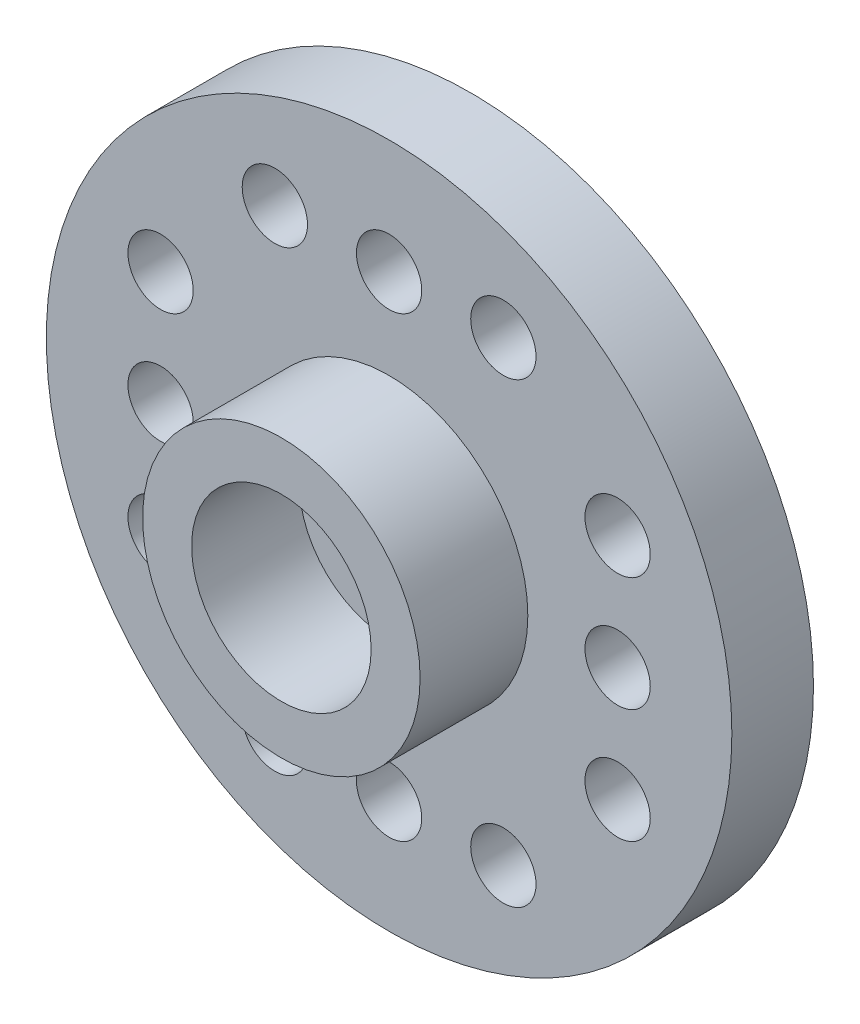
ISO-10303-21;
HEADER;
FILE_DESCRIPTION(('STEP AP214'),'2;1');
FILE_NAME('part.step','',(''),(''),'','','');
FILE_SCHEMA(('AUTOMOTIVE_DESIGN { 1 0 10303 214 1 1 1 1 }'));
ENDSEC;
DATA;
#1=APPLICATION_CONTEXT('core data for automotive mechanical design processes');
#2=APPLICATION_PROTOCOL_DEFINITION('international standard','automotive_design',2000,#1);
#3=PRODUCT_CONTEXT('',#1,'mechanical');
#4=PRODUCT('Part','Part','',(#3));
#5=PRODUCT_RELATED_PRODUCT_CATEGORY('part','',(#4));
#6=PRODUCT_DEFINITION_FORMATION('','',#4);
#7=PRODUCT_DEFINITION_CONTEXT('part definition',#1,'design');
#8=PRODUCT_DEFINITION('design','',#6,#7);
#9=PRODUCT_DEFINITION_SHAPE('','',#8);
#10=(LENGTH_UNIT() NAMED_UNIT(*) SI_UNIT(.MILLI.,.METRE.));
#11=(NAMED_UNIT(*) PLANE_ANGLE_UNIT() SI_UNIT($,.RADIAN.));
#12=(NAMED_UNIT(*) SI_UNIT($,.STERADIAN.) SOLID_ANGLE_UNIT());
#13=UNCERTAINTY_MEASURE_WITH_UNIT(LENGTH_MEASURE(1.E-05),#10,'distance_accuracy_value','');
#14=(GEOMETRIC_REPRESENTATION_CONTEXT(3) GLOBAL_UNCERTAINTY_ASSIGNED_CONTEXT((#13)) GLOBAL_UNIT_ASSIGNED_CONTEXT((#10,
#11,#12)) REPRESENTATION_CONTEXT('',''));
#15=CARTESIAN_POINT('',(0.,0.,0.));
#16=DIRECTION('',(0.,0.,1.));
#17=DIRECTION('',(1.,0.,0.));
#18=AXIS2_PLACEMENT_3D('',#15,#16,#17);
#19=CARTESIAN_POINT('',(0.,0.,1.2));
#20=DIRECTION('',(0.,0.,-1.));
#21=DIRECTION('',(-1.,0.,0.));
#22=AXIS2_PLACEMENT_3D('',#19,#20,#21);
#23=PLANE('',#22);
#24=CARTESIAN_POINT('',(0.,0.,1.2));
#25=DIRECTION('',(0.,0.,-1.));
#26=DIRECTION('',(-1.,0.,0.));
#27=AXIS2_PLACEMENT_3D('',#24,#25,#26);
#28=CIRCLE('',#27,4.7);
#29=CARTESIAN_POINT('',(-4.7,0.,1.2));
#30=VERTEX_POINT('',#29);
#31=EDGE_CURVE('E55',#30,#30,#28,.T.);
#32=ORIENTED_EDGE('',*,*,#31,.T.);
#33=EDGE_LOOP('',(#32));
#34=FACE_BOUND('',#33,.T.);
#35=CARTESIAN_POINT('',(0.,0.,1.2));
#36=DIRECTION('',(0.,0.,-1.));
#37=DIRECTION('',(-1.,0.,0.));
#38=AXIS2_PLACEMENT_3D('',#35,#36,#37);
#39=CIRCLE('',#38,3.15);
#40=CARTESIAN_POINT('',(-3.15,0.,1.2));
#41=VERTEX_POINT('',#40);
#42=EDGE_CURVE('E409',#41,#41,#39,.T.);
#43=ORIENTED_EDGE('',*,*,#42,.F.);
#44=EDGE_LOOP('',(#43));
#45=FACE_BOUND('',#44,.T.);
#46=ADVANCED_FACE('F33',(#34,#45),#23,.T.);
#47=CARTESIAN_POINT('',(0.,0.,5.8));
#48=DIRECTION('',(0.,0.,-1.));
#49=DIRECTION('',(-1.,0.,0.));
#50=AXIS2_PLACEMENT_3D('',#47,#48,#49);
#51=CYLINDRICAL_SURFACE('',#50,1.5);
#52=CARTESIAN_POINT('',(0.,0.,2.5));
#53=DIRECTION('',(0.,0.,1.));
#54=DIRECTION('',(1.,0.,0.));
#55=AXIS2_PLACEMENT_3D('',#52,#53,#54);
#56=CIRCLE('',#55,1.5);
#57=CARTESIAN_POINT('',(1.5,0.,2.5));
#58=VERTEX_POINT('',#57);
#59=EDGE_CURVE('E52',#58,#58,#56,.T.);
#60=ORIENTED_EDGE('',*,*,#59,.T.);
#61=EDGE_LOOP('',(#60));
#62=FACE_BOUND('',#61,.T.);
#63=CARTESIAN_POINT('',(0.,0.,1.2));
#64=DIRECTION('',(0.,0.,-1.));
#65=DIRECTION('',(-1.,0.,0.));
#66=AXIS2_PLACEMENT_3D('',#63,#64,#65);
#67=CIRCLE('',#66,1.5);
#68=CARTESIAN_POINT('',(-1.5,0.,1.2));
#69=VERTEX_POINT('',#68);
#70=EDGE_CURVE('E62',#69,#69,#67,.T.);
#71=ORIENTED_EDGE('',*,*,#70,.T.);
#72=EDGE_LOOP('',(#71));
#73=FACE_BOUND('',#72,.T.);
#74=ADVANCED_FACE('F84',(#62,#73),#51,.F.);
#75=CARTESIAN_POINT('',(0.,0.,2.5));
#76=DIRECTION('',(0.,0.,1.));
#77=DIRECTION('',(1.,0.,0.));
#78=AXIS2_PLACEMENT_3D('',#75,#76,#77);
#79=PLANE('',#78);
#80=CARTESIAN_POINT('',(-3.50000000000125,-7.,2.5));
#81=DIRECTION('',(0.,0.,1.));
#82=DIRECTION('',(1.,0.,0.));
#83=AXIS2_PLACEMENT_3D('',#80,#81,#82);
#84=CIRCLE('',#83,1.);
#85=CARTESIAN_POINT('',(-2.50000000000125,-7.,2.5));
#86=VERTEX_POINT('',#85);
#87=EDGE_CURVE('E333',#86,#86,#84,.T.);
#88=ORIENTED_EDGE('',*,*,#87,.F.);
#89=EDGE_LOOP('',(#88));
#90=FACE_BOUND('',#89,.T.);
#91=CARTESIAN_POINT('',(3.5,-7.,2.5));
#92=DIRECTION('',(0.,0.,1.));
#93=DIRECTION('',(1.,0.,0.));
#94=AXIS2_PLACEMENT_3D('',#91,#92,#93);
#95=CIRCLE('',#94,1.);
#96=CARTESIAN_POINT('',(4.5,-7.,2.5));
#97=VERTEX_POINT('',#96);
#98=EDGE_CURVE('E343',#97,#97,#95,.T.);
#99=ORIENTED_EDGE('',*,*,#98,.F.);
#100=EDGE_LOOP('',(#99));
#101=FACE_BOUND('',#100,.T.);
#102=CARTESIAN_POINT('',(-7.00000000000001,3.5,2.5));
#103=DIRECTION('',(0.,0.,1.));
#104=DIRECTION('',(1.,0.,0.));
#105=AXIS2_PLACEMENT_3D('',#102,#103,#104);
#106=CIRCLE('',#105,1.);
#107=CARTESIAN_POINT('',(-6.00000000000001,3.5,2.5));
#108=VERTEX_POINT('',#107);
#109=EDGE_CURVE('E349',#108,#108,#106,.T.);
#110=ORIENTED_EDGE('',*,*,#109,.F.);
#111=EDGE_LOOP('',(#110));
#112=FACE_BOUND('',#111,.T.);
#113=CARTESIAN_POINT('',(-7.00000000000001,-3.5,2.5));
#114=DIRECTION('',(0.,0.,1.));
#115=DIRECTION('',(1.,0.,0.));
#116=AXIS2_PLACEMENT_3D('',#113,#114,#115);
#117=CIRCLE('',#116,1.);
#118=CARTESIAN_POINT('',(-6.00000000000001,-3.5,2.5));
#119=VERTEX_POINT('',#118);
#120=EDGE_CURVE('E355',#119,#119,#117,.T.);
#121=ORIENTED_EDGE('',*,*,#120,.F.);
#122=EDGE_LOOP('',(#121));
#123=FACE_BOUND('',#122,.T.);
#124=CARTESIAN_POINT('',(7.00000000000002,-3.5,2.5));
#125=DIRECTION('',(0.,0.,1.));
#126=DIRECTION('',(1.,0.,0.));
#127=AXIS2_PLACEMENT_3D('',#124,#125,#126);
#128=CIRCLE('',#127,1.);
#129=CARTESIAN_POINT('',(8.00000000000002,-3.5,2.5));
#130=VERTEX_POINT('',#129);
#131=EDGE_CURVE('E361',#130,#130,#128,.T.);
#132=ORIENTED_EDGE('',*,*,#131,.F.);
#133=EDGE_LOOP('',(#132));
#134=FACE_BOUND('',#133,.T.);
#135=CARTESIAN_POINT('',(7.00000000000001,3.5,2.5));
#136=DIRECTION('',(0.,0.,1.));
#137=DIRECTION('',(1.,0.,0.));
#138=AXIS2_PLACEMENT_3D('',#135,#136,#137);
#139=CIRCLE('',#138,1.);
#140=CARTESIAN_POINT('',(8.00000000000001,3.5,2.5));
#141=VERTEX_POINT('',#140);
#142=EDGE_CURVE('E367',#141,#141,#139,.T.);
#143=ORIENTED_EDGE('',*,*,#142,.F.);
#144=EDGE_LOOP('',(#143));
#145=FACE_BOUND('',#144,.T.);
#146=CARTESIAN_POINT('',(3.5,7.,2.5));
#147=DIRECTION('',(0.,0.,1.));
#148=DIRECTION('',(1.,0.,0.));
#149=AXIS2_PLACEMENT_3D('',#146,#147,#148);
#150=CIRCLE('',#149,1.);
#151=CARTESIAN_POINT('',(4.5,7.,2.5));
#152=VERTEX_POINT('',#151);
#153=EDGE_CURVE('E373',#152,#152,#150,.T.);
#154=ORIENTED_EDGE('',*,*,#153,.F.);
#155=EDGE_LOOP('',(#154));
#156=FACE_BOUND('',#155,.T.);
#157=CARTESIAN_POINT('',(-3.5,7.,2.5));
#158=DIRECTION('',(0.,0.,1.));
#159=DIRECTION('',(1.,0.,0.));
#160=AXIS2_PLACEMENT_3D('',#157,#158,#159);
#161=CIRCLE('',#160,0.999999999999999);
#162=CARTESIAN_POINT('',(-2.5,7.,2.5));
#163=VERTEX_POINT('',#162);
#164=EDGE_CURVE('E379',#163,#163,#161,.T.);
#165=ORIENTED_EDGE('',*,*,#164,.F.);
#166=EDGE_LOOP('',(#165));
#167=FACE_BOUND('',#166,.T.);
#168=CARTESIAN_POINT('',(-7.,0.,2.5));
#169=DIRECTION('',(0.,0.,1.));
#170=DIRECTION('',(1.,0.,0.));
#171=AXIS2_PLACEMENT_3D('',#168,#169,#170);
#172=CIRCLE('',#171,1.);
#173=CARTESIAN_POINT('',(-6.,0.,2.5));
#174=VERTEX_POINT('',#173);
#175=EDGE_CURVE('E385',#174,#174,#172,.T.);
#176=ORIENTED_EDGE('',*,*,#175,.F.);
#177=EDGE_LOOP('',(#176));
#178=FACE_BOUND('',#177,.T.);
#179=CARTESIAN_POINT('',(7.,0.,2.5));
#180=DIRECTION('',(0.,0.,1.));
#181=DIRECTION('',(1.,0.,0.));
#182=AXIS2_PLACEMENT_3D('',#179,#180,#181);
#183=CIRCLE('',#182,1.);
#184=CARTESIAN_POINT('',(8.,0.,2.5));
#185=VERTEX_POINT('',#184);
#186=EDGE_CURVE('E391',#185,#185,#183,.T.);
#187=ORIENTED_EDGE('',*,*,#186,.F.);
#188=EDGE_LOOP('',(#187));
#189=FACE_BOUND('',#188,.T.);
#190=CARTESIAN_POINT('',(0.,-7.,2.5));
#191=DIRECTION('',(0.,0.,1.));
#192=DIRECTION('',(1.,0.,0.));
#193=AXIS2_PLACEMENT_3D('',#190,#191,#192);
#194=CIRCLE('',#193,1.);
#195=CARTESIAN_POINT('',(1.,-7.,2.5));
#196=VERTEX_POINT('',#195);
#197=EDGE_CURVE('E397',#196,#196,#194,.T.);
#198=ORIENTED_EDGE('',*,*,#197,.F.);
#199=EDGE_LOOP('',(#198));
#200=FACE_BOUND('',#199,.T.);
#201=CARTESIAN_POINT('',(0.,7.,2.5));
#202=DIRECTION('',(0.,0.,1.));
#203=DIRECTION('',(1.,0.,0.));
#204=AXIS2_PLACEMENT_3D('',#201,#202,#203);
#205=CIRCLE('',#204,1.);
#206=CARTESIAN_POINT('',(1.,7.,2.5));
#207=VERTEX_POINT('',#206);
#208=EDGE_CURVE('E403',#207,#207,#205,.T.);
#209=ORIENTED_EDGE('',*,*,#208,.F.);
#210=EDGE_LOOP('',(#209));
#211=FACE_BOUND('',#210,.T.);
#212=CARTESIAN_POINT('',(0.,0.,2.5));
#213=DIRECTION('',(0.,0.,1.));
#214=DIRECTION('',(1.,0.,0.));
#215=AXIS2_PLACEMENT_3D('',#212,#213,#214);
#216=CIRCLE('',#215,10.5);
#217=CARTESIAN_POINT('',(10.5,0.,2.5));
#218=VERTEX_POINT('',#217);
#219=EDGE_CURVE('E44',#218,#218,#216,.T.);
#220=ORIENTED_EDGE('',*,*,#219,.T.);
#221=EDGE_LOOP('',(#220));
#222=FACE_BOUND('',#221,.T.);
#223=CARTESIAN_POINT('',(0.,0.,2.5));
#224=DIRECTION('',(0.,0.,1.));
#225=DIRECTION('',(1.,0.,0.));
#226=AXIS2_PLACEMENT_3D('',#223,#224,#225);
#227=CIRCLE('',#226,4.25);
#228=CARTESIAN_POINT('',(4.25,0.,2.5));
#229=VERTEX_POINT('',#228);
#230=EDGE_CURVE('E59',#229,#229,#227,.T.);
#231=ORIENTED_EDGE('',*,*,#230,.F.);
#232=EDGE_LOOP('',(#231));
#233=FACE_BOUND('',#232,.T.);
#234=ADVANCED_FACE('F82',(#90,#101,#112,#123,#134,#145,#156,#167,#178,#189,#200,#211,#222,#233),
#79,.T.);
#235=CARTESIAN_POINT('',(0.,0.,2.5));
#236=DIRECTION('',(0.,0.,-1.));
#237=DIRECTION('',(-1.,0.,0.));
#238=AXIS2_PLACEMENT_3D('',#235,#236,#237);
#239=CYLINDRICAL_SURFACE('',#238,10.5);
#240=ORIENTED_EDGE('',*,*,#219,.F.);
#241=EDGE_LOOP('',(#240));
#242=FACE_BOUND('',#241,.T.);
#243=CARTESIAN_POINT('',(0.,0.,0.));
#244=DIRECTION('',(0.,0.,1.));
#245=DIRECTION('',(1.,0.,0.));
#246=AXIS2_PLACEMENT_3D('',#243,#244,#245);
#247=CIRCLE('',#246,10.5);
#248=CARTESIAN_POINT('',(10.5,0.,0.));
#249=VERTEX_POINT('',#248);
#250=EDGE_CURVE('E49',#249,#249,#247,.T.);
#251=ORIENTED_EDGE('',*,*,#250,.T.);
#252=EDGE_LOOP('',(#251));
#253=FACE_BOUND('',#252,.T.);
#254=ADVANCED_FACE('F35',(#242,#253),#239,.T.);
#255=CARTESIAN_POINT('',(0.,0.,0.));
#256=DIRECTION('',(0.,0.,1.));
#257=DIRECTION('',(1.,0.,0.));
#258=AXIS2_PLACEMENT_3D('',#255,#256,#257);
#259=PLANE('',#258);
#260=CARTESIAN_POINT('',(-3.50000000000125,-7.,0.));
#261=DIRECTION('',(0.,0.,-1.));
#262=DIRECTION('',(-1.,0.,0.));
#263=AXIS2_PLACEMENT_3D('',#260,#261,#262);
#264=CIRCLE('',#263,1.);
#265=CARTESIAN_POINT('',(-4.50000000000125,-7.,0.));
#266=VERTEX_POINT('',#265);
#267=EDGE_CURVE('E336',#266,#266,#264,.T.);
#268=ORIENTED_EDGE('',*,*,#267,.F.);
#269=EDGE_LOOP('',(#268));
#270=FACE_BOUND('',#269,.T.);
#271=CARTESIAN_POINT('',(3.5,-7.,0.));
#272=DIRECTION('',(0.,0.,-1.));
#273=DIRECTION('',(-1.,0.,0.));
#274=AXIS2_PLACEMENT_3D('',#271,#272,#273);
#275=CIRCLE('',#274,1.);
#276=CARTESIAN_POINT('',(2.5,-7.,0.));
#277=VERTEX_POINT('',#276);
#278=EDGE_CURVE('E338',#277,#277,#275,.T.);
#279=ORIENTED_EDGE('',*,*,#278,.F.);
#280=EDGE_LOOP('',(#279));
#281=FACE_BOUND('',#280,.T.);
#282=CARTESIAN_POINT('',(-7.00000000000001,3.5,0.));
#283=DIRECTION('',(0.,0.,-1.));
#284=DIRECTION('',(-1.,0.,0.));
#285=AXIS2_PLACEMENT_3D('',#282,#283,#284);
#286=CIRCLE('',#285,1.);
#287=CARTESIAN_POINT('',(-8.00000000000001,3.5,0.));
#288=VERTEX_POINT('',#287);
#289=EDGE_CURVE('E346',#288,#288,#286,.T.);
#290=ORIENTED_EDGE('',*,*,#289,.F.);
#291=EDGE_LOOP('',(#290));
#292=FACE_BOUND('',#291,.T.);
#293=CARTESIAN_POINT('',(-7.00000000000001,-3.5,0.));
#294=DIRECTION('',(0.,0.,-1.));
#295=DIRECTION('',(-1.,0.,0.));
#296=AXIS2_PLACEMENT_3D('',#293,#294,#295);
#297=CIRCLE('',#296,1.);
#298=CARTESIAN_POINT('',(-8.00000000000001,-3.5,0.));
#299=VERTEX_POINT('',#298);
#300=EDGE_CURVE('E352',#299,#299,#297,.T.);
#301=ORIENTED_EDGE('',*,*,#300,.F.);
#302=EDGE_LOOP('',(#301));
#303=FACE_BOUND('',#302,.T.);
#304=CARTESIAN_POINT('',(7.00000000000002,-3.5,0.));
#305=DIRECTION('',(0.,0.,-1.));
#306=DIRECTION('',(-1.,0.,0.));
#307=AXIS2_PLACEMENT_3D('',#304,#305,#306);
#308=CIRCLE('',#307,1.);
#309=CARTESIAN_POINT('',(6.00000000000002,-3.5,0.));
#310=VERTEX_POINT('',#309);
#311=EDGE_CURVE('E358',#310,#310,#308,.T.);
#312=ORIENTED_EDGE('',*,*,#311,.F.);
#313=EDGE_LOOP('',(#312));
#314=FACE_BOUND('',#313,.T.);
#315=CARTESIAN_POINT('',(7.00000000000001,3.5,0.));
#316=DIRECTION('',(0.,0.,-1.));
#317=DIRECTION('',(-1.,0.,0.));
#318=AXIS2_PLACEMENT_3D('',#315,#316,#317);
#319=CIRCLE('',#318,1.);
#320=CARTESIAN_POINT('',(6.00000000000001,3.5,0.));
#321=VERTEX_POINT('',#320);
#322=EDGE_CURVE('E364',#321,#321,#319,.T.);
#323=ORIENTED_EDGE('',*,*,#322,.F.);
#324=EDGE_LOOP('',(#323));
#325=FACE_BOUND('',#324,.T.);
#326=CARTESIAN_POINT('',(3.5,7.,0.));
#327=DIRECTION('',(0.,0.,-1.));
#328=DIRECTION('',(-1.,0.,0.));
#329=AXIS2_PLACEMENT_3D('',#326,#327,#328);
#330=CIRCLE('',#329,1.);
#331=CARTESIAN_POINT('',(2.5,7.,0.));
#332=VERTEX_POINT('',#331);
#333=EDGE_CURVE('E370',#332,#332,#330,.T.);
#334=ORIENTED_EDGE('',*,*,#333,.F.);
#335=EDGE_LOOP('',(#334));
#336=FACE_BOUND('',#335,.T.);
#337=CARTESIAN_POINT('',(-3.5,7.,0.));
#338=DIRECTION('',(0.,0.,-1.));
#339=DIRECTION('',(-1.,0.,0.));
#340=AXIS2_PLACEMENT_3D('',#337,#338,#339);
#341=CIRCLE('',#340,0.999999999999999);
#342=CARTESIAN_POINT('',(-4.5,7.,0.));
#343=VERTEX_POINT('',#342);
#344=EDGE_CURVE('E376',#343,#343,#341,.T.);
#345=ORIENTED_EDGE('',*,*,#344,.F.);
#346=EDGE_LOOP('',(#345));
#347=FACE_BOUND('',#346,.T.);
#348=CARTESIAN_POINT('',(-7.,0.,0.));
#349=DIRECTION('',(0.,0.,-1.));
#350=DIRECTION('',(-1.,0.,0.));
#351=AXIS2_PLACEMENT_3D('',#348,#349,#350);
#352=CIRCLE('',#351,1.);
#353=CARTESIAN_POINT('',(-8.,0.,0.));
#354=VERTEX_POINT('',#353);
#355=EDGE_CURVE('E382',#354,#354,#352,.T.);
#356=ORIENTED_EDGE('',*,*,#355,.F.);
#357=EDGE_LOOP('',(#356));
#358=FACE_BOUND('',#357,.T.);
#359=CARTESIAN_POINT('',(7.,0.,0.));
#360=DIRECTION('',(0.,0.,-1.));
#361=DIRECTION('',(-1.,0.,0.));
#362=AXIS2_PLACEMENT_3D('',#359,#360,#361);
#363=CIRCLE('',#362,1.);
#364=CARTESIAN_POINT('',(6.,0.,0.));
#365=VERTEX_POINT('',#364);
#366=EDGE_CURVE('E388',#365,#365,#363,.T.);
#367=ORIENTED_EDGE('',*,*,#366,.F.);
#368=EDGE_LOOP('',(#367));
#369=FACE_BOUND('',#368,.T.);
#370=CARTESIAN_POINT('',(0.,-7.,0.));
#371=DIRECTION('',(0.,0.,-1.));
#372=DIRECTION('',(-1.,0.,0.));
#373=AXIS2_PLACEMENT_3D('',#370,#371,#372);
#374=CIRCLE('',#373,1.);
#375=CARTESIAN_POINT('',(-1.,-7.,0.));
#376=VERTEX_POINT('',#375);
#377=EDGE_CURVE('E394',#376,#376,#374,.T.);
#378=ORIENTED_EDGE('',*,*,#377,.F.);
#379=EDGE_LOOP('',(#378));
#380=FACE_BOUND('',#379,.T.);
#381=CARTESIAN_POINT('',(0.,7.,0.));
#382=DIRECTION('',(0.,0.,-1.));
#383=DIRECTION('',(-1.,0.,0.));
#384=AXIS2_PLACEMENT_3D('',#381,#382,#383);
#385=CIRCLE('',#384,1.);
#386=CARTESIAN_POINT('',(-1.,7.,0.));
#387=VERTEX_POINT('',#386);
#388=EDGE_CURVE('E400',#387,#387,#385,.T.);
#389=ORIENTED_EDGE('',*,*,#388,.F.);
#390=EDGE_LOOP('',(#389));
#391=FACE_BOUND('',#390,.T.);
#392=CARTESIAN_POINT('',(0.,0.,0.));
#393=DIRECTION('',(0.,0.,-1.));
#394=DIRECTION('',(-1.,0.,0.));
#395=AXIS2_PLACEMENT_3D('',#392,#393,#394);
#396=CIRCLE('',#395,4.7);
#397=CARTESIAN_POINT('',(-4.7,0.,0.));
#398=VERTEX_POINT('',#397);
#399=EDGE_CURVE('E67',#398,#398,#396,.T.);
#400=ORIENTED_EDGE('',*,*,#399,.F.);
#401=EDGE_LOOP('',(#400));
#402=FACE_BOUND('',#401,.T.);
#403=ORIENTED_EDGE('',*,*,#250,.F.);
#404=EDGE_LOOP('',(#403));
#405=FACE_BOUND('',#404,.T.);
#406=ADVANCED_FACE('F92',(#270,#281,#292,#303,#314,#325,#336,#347,#358,#369,#380,#391,#402,
#405),#259,.F.);
#407=CARTESIAN_POINT('',(0.,0.,5.8));
#408=DIRECTION('',(0.,0.,1.));
#409=DIRECTION('',(1.,0.,0.));
#410=AXIS2_PLACEMENT_3D('',#407,#408,#409);
#411=PLANE('',#410);
#412=CARTESIAN_POINT('',(0.,0.,5.8));
#413=DIRECTION('',(0.,0.,1.));
#414=DIRECTION('',(1.,0.,0.));
#415=AXIS2_PLACEMENT_3D('',#412,#413,#414);
#416=CIRCLE('',#415,4.25);
#417=CARTESIAN_POINT('',(4.25,0.,5.8));
#418=VERTEX_POINT('',#417);
#419=EDGE_CURVE('E74',#418,#418,#416,.T.);
#420=ORIENTED_EDGE('',*,*,#419,.T.);
#421=EDGE_LOOP('',(#420));
#422=FACE_BOUND('',#421,.T.);
#423=CARTESIAN_POINT('',(0.,0.,5.8));
#424=DIRECTION('',(0.,0.,1.));
#425=DIRECTION('',(1.,0.,0.));
#426=AXIS2_PLACEMENT_3D('',#423,#424,#425);
#427=CIRCLE('',#426,2.75);
#428=CARTESIAN_POINT('',(2.75,0.,5.8));
#429=VERTEX_POINT('',#428);
#430=EDGE_CURVE('E54',#429,#429,#427,.T.);
#431=ORIENTED_EDGE('',*,*,#430,.F.);
#432=EDGE_LOOP('',(#431));
#433=FACE_BOUND('',#432,.T.);
#434=ADVANCED_FACE('F131',(#422,#433),#411,.T.);
#435=CARTESIAN_POINT('',(0.,0.,5.8));
#436=DIRECTION('',(0.,0.,-1.));
#437=DIRECTION('',(-1.,0.,0.));
#438=AXIS2_PLACEMENT_3D('',#435,#436,#437);
#439=CYLINDRICAL_SURFACE('',#438,4.25);
#440=ORIENTED_EDGE('',*,*,#419,.F.);
#441=EDGE_LOOP('',(#440));
#442=FACE_BOUND('',#441,.T.);
#443=ORIENTED_EDGE('',*,*,#230,.T.);
#444=EDGE_LOOP('',(#443));
#445=FACE_BOUND('',#444,.T.);
#446=ADVANCED_FACE('F80',(#442,#445),#439,.T.);
#447=CARTESIAN_POINT('',(0.,0.,5.8));
#448=DIRECTION('',(0.,0.,-1.));
#449=DIRECTION('',(-1.,0.,0.));
#450=AXIS2_PLACEMENT_3D('',#447,#448,#449);
#451=CYLINDRICAL_SURFACE('',#450,2.75);
#452=ORIENTED_EDGE('',*,*,#430,.T.);
#453=EDGE_LOOP('',(#452));
#454=FACE_BOUND('',#453,.T.);
#455=CARTESIAN_POINT('',(0.,0.,2.5));
#456=DIRECTION('',(0.,0.,1.));
#457=DIRECTION('',(1.,0.,0.));
#458=AXIS2_PLACEMENT_3D('',#455,#456,#457);
#459=CIRCLE('',#458,2.75);
#460=CARTESIAN_POINT('',(2.75,0.,2.5));
#461=VERTEX_POINT('',#460);
#462=EDGE_CURVE('E40',#461,#461,#459,.F.);
#463=ORIENTED_EDGE('',*,*,#462,.T.);
#464=EDGE_LOOP('',(#463));
#465=FACE_BOUND('',#464,.T.);
#466=ADVANCED_FACE('F100',(#454,#465),#451,.F.);
#467=ORIENTED_EDGE('',*,*,#59,.F.);
#468=EDGE_LOOP('',(#467));
#469=FACE_BOUND('',#468,.T.);
#470=ORIENTED_EDGE('',*,*,#462,.F.);
#471=EDGE_LOOP('',(#470));
#472=FACE_BOUND('',#471,.T.);
#473=ADVANCED_FACE('F87',(#469,#472),#79,.T.);
#474=CARTESIAN_POINT('',(0.,0.,1.2));
#475=DIRECTION('',(0.,0.,-1.));
#476=DIRECTION('',(-1.,0.,0.));
#477=AXIS2_PLACEMENT_3D('',#474,#475,#476);
#478=CYLINDRICAL_SURFACE('',#477,4.7);
#479=ORIENTED_EDGE('',*,*,#31,.F.);
#480=EDGE_LOOP('',(#479));
#481=FACE_BOUND('',#480,.T.);
#482=ORIENTED_EDGE('',*,*,#399,.T.);
#483=EDGE_LOOP('',(#482));
#484=FACE_BOUND('',#483,.T.);
#485=ADVANCED_FACE('F99',(#481,#484),#478,.F.);
#486=CARTESIAN_POINT('',(0.,0.,1.2));
#487=DIRECTION('',(0.,0.,-1.));
#488=DIRECTION('',(-1.,0.,0.));
#489=AXIS2_PLACEMENT_3D('',#486,#487,#488);
#490=CIRCLE('',#489,3.);
#491=CARTESIAN_POINT('',(-3.,0.,1.2));
#492=VERTEX_POINT('',#491);
#493=EDGE_CURVE('E10',#492,#492,#490,.F.);
#494=ORIENTED_EDGE('',*,*,#493,.F.);
#495=EDGE_LOOP('',(#494));
#496=FACE_BOUND('',#495,.T.);
#497=ORIENTED_EDGE('',*,*,#70,.F.);
#498=EDGE_LOOP('',(#497));
#499=FACE_BOUND('',#498,.T.);
#500=ADVANCED_FACE('F104',(#496,#499),#23,.T.);
#501=CARTESIAN_POINT('',(0.,0.,0.));
#502=DIRECTION('',(0.,0.,-1.));
#503=DIRECTION('',(-1.,0.,0.));
#504=AXIS2_PLACEMENT_3D('',#501,#502,#503);
#505=PLANE('',#504);
#506=CARTESIAN_POINT('',(0.,0.,0.));
#507=DIRECTION('',(0.,0.,-1.));
#508=DIRECTION('',(-1.,0.,0.));
#509=AXIS2_PLACEMENT_3D('',#506,#507,#508);
#510=CIRCLE('',#509,3.15);
#511=CARTESIAN_POINT('',(-3.15,0.,0.));
#512=VERTEX_POINT('',#511);
#513=EDGE_CURVE('E72',#512,#512,#510,.T.);
#514=ORIENTED_EDGE('',*,*,#513,.T.);
#515=EDGE_LOOP('',(#514));
#516=FACE_BOUND('',#515,.T.);
#517=CARTESIAN_POINT('',(0.,0.,0.));
#518=DIRECTION('',(0.,0.,-1.));
#519=DIRECTION('',(-1.,0.,0.));
#520=AXIS2_PLACEMENT_3D('',#517,#518,#519);
#521=CIRCLE('',#520,3.);
#522=CARTESIAN_POINT('',(-3.,0.,0.));
#523=VERTEX_POINT('',#522);
#524=EDGE_CURVE('E406',#523,#523,#521,.T.);
#525=ORIENTED_EDGE('',*,*,#524,.F.);
#526=EDGE_LOOP('',(#525));
#527=FACE_BOUND('',#526,.T.);
#528=ADVANCED_FACE('F111',(#516,#527),#505,.T.);
#529=CARTESIAN_POINT('',(0.,0.,0.));
#530=DIRECTION('',(0.,0.,1.));
#531=DIRECTION('',(1.,0.,0.));
#532=AXIS2_PLACEMENT_3D('',#529,#530,#531);
#533=CYLINDRICAL_SURFACE('',#532,3.15);
#534=ORIENTED_EDGE('',*,*,#513,.F.);
#535=EDGE_LOOP('',(#534));
#536=FACE_BOUND('',#535,.T.);
#537=ORIENTED_EDGE('',*,*,#42,.T.);
#538=EDGE_LOOP('',(#537));
#539=FACE_BOUND('',#538,.T.);
#540=ADVANCED_FACE('F117',(#536,#539),#533,.T.);
#541=CARTESIAN_POINT('',(0.,0.,0.));
#542=DIRECTION('',(0.,0.,1.));
#543=DIRECTION('',(1.,0.,0.));
#544=AXIS2_PLACEMENT_3D('',#541,#542,#543);
#545=CYLINDRICAL_SURFACE('',#544,3.);
#546=ORIENTED_EDGE('',*,*,#524,.T.);
#547=EDGE_LOOP('',(#546));
#548=FACE_BOUND('',#547,.T.);
#549=ORIENTED_EDGE('',*,*,#493,.T.);
#550=EDGE_LOOP('',(#549));
#551=FACE_BOUND('',#550,.T.);
#552=ADVANCED_FACE('F187',(#548,#551),#545,.F.);
#553=CARTESIAN_POINT('',(0.,7.,5.8));
#554=DIRECTION('',(0.,0.,-1.));
#555=DIRECTION('',(-1.,0.,0.));
#556=AXIS2_PLACEMENT_3D('',#553,#554,#555);
#557=CYLINDRICAL_SURFACE('',#556,1.);
#558=ORIENTED_EDGE('',*,*,#208,.T.);
#559=EDGE_LOOP('',(#558));
#560=FACE_BOUND('',#559,.T.);
#561=ORIENTED_EDGE('',*,*,#388,.T.);
#562=EDGE_LOOP('',(#561));
#563=FACE_BOUND('',#562,.T.);
#564=ADVANCED_FACE('F195',(#560,#563),#557,.F.);
#565=CARTESIAN_POINT('',(0.,-7.,5.8));
#566=DIRECTION('',(0.,0.,-1.));
#567=DIRECTION('',(-1.,0.,0.));
#568=AXIS2_PLACEMENT_3D('',#565,#566,#567);
#569=CYLINDRICAL_SURFACE('',#568,1.);
#570=ORIENTED_EDGE('',*,*,#197,.T.);
#571=EDGE_LOOP('',(#570));
#572=FACE_BOUND('',#571,.T.);
#573=ORIENTED_EDGE('',*,*,#377,.T.);
#574=EDGE_LOOP('',(#573));
#575=FACE_BOUND('',#574,.T.);
#576=ADVANCED_FACE('F217',(#572,#575),#569,.F.);
#577=CARTESIAN_POINT('',(7.,0.,5.8));
#578=DIRECTION('',(0.,0.,-1.));
#579=DIRECTION('',(-1.,0.,0.));
#580=AXIS2_PLACEMENT_3D('',#577,#578,#579);
#581=CYLINDRICAL_SURFACE('',#580,1.);
#582=ORIENTED_EDGE('',*,*,#186,.T.);
#583=EDGE_LOOP('',(#582));
#584=FACE_BOUND('',#583,.T.);
#585=ORIENTED_EDGE('',*,*,#366,.T.);
#586=EDGE_LOOP('',(#585));
#587=FACE_BOUND('',#586,.T.);
#588=ADVANCED_FACE('F227',(#584,#587),#581,.F.);
#589=CARTESIAN_POINT('',(-7.,0.,5.8));
#590=DIRECTION('',(0.,0.,-1.));
#591=DIRECTION('',(-1.,0.,0.));
#592=AXIS2_PLACEMENT_3D('',#589,#590,#591);
#593=CYLINDRICAL_SURFACE('',#592,1.);
#594=ORIENTED_EDGE('',*,*,#175,.T.);
#595=EDGE_LOOP('',(#594));
#596=FACE_BOUND('',#595,.T.);
#597=ORIENTED_EDGE('',*,*,#355,.T.);
#598=EDGE_LOOP('',(#597));
#599=FACE_BOUND('',#598,.T.);
#600=ADVANCED_FACE('F237',(#596,#599),#593,.F.);
#601=CARTESIAN_POINT('',(-3.5,7.,5.8));
#602=DIRECTION('',(0.,0.,-1.));
#603=DIRECTION('',(-1.,0.,0.));
#604=AXIS2_PLACEMENT_3D('',#601,#602,#603);
#605=CYLINDRICAL_SURFACE('',#604,0.999999999999999);
#606=ORIENTED_EDGE('',*,*,#164,.T.);
#607=EDGE_LOOP('',(#606));
#608=FACE_BOUND('',#607,.T.);
#609=ORIENTED_EDGE('',*,*,#344,.T.);
#610=EDGE_LOOP('',(#609));
#611=FACE_BOUND('',#610,.T.);
#612=ADVANCED_FACE('F247',(#608,#611),#605,.F.);
#613=CARTESIAN_POINT('',(3.5,7.,5.8));
#614=DIRECTION('',(0.,0.,-1.));
#615=DIRECTION('',(-1.,0.,0.));
#616=AXIS2_PLACEMENT_3D('',#613,#614,#615);
#617=CYLINDRICAL_SURFACE('',#616,1.);
#618=ORIENTED_EDGE('',*,*,#153,.T.);
#619=EDGE_LOOP('',(#618));
#620=FACE_BOUND('',#619,.T.);
#621=ORIENTED_EDGE('',*,*,#333,.T.);
#622=EDGE_LOOP('',(#621));
#623=FACE_BOUND('',#622,.T.);
#624=ADVANCED_FACE('F257',(#620,#623),#617,.F.);
#625=CARTESIAN_POINT('',(7.00000000000001,3.5,5.8));
#626=DIRECTION('',(0.,0.,-1.));
#627=DIRECTION('',(-1.,0.,0.));
#628=AXIS2_PLACEMENT_3D('',#625,#626,#627);
#629=CYLINDRICAL_SURFACE('',#628,1.);
#630=ORIENTED_EDGE('',*,*,#142,.T.);
#631=EDGE_LOOP('',(#630));
#632=FACE_BOUND('',#631,.T.);
#633=ORIENTED_EDGE('',*,*,#322,.T.);
#634=EDGE_LOOP('',(#633));
#635=FACE_BOUND('',#634,.T.);
#636=ADVANCED_FACE('F267',(#632,#635),#629,.F.);
#637=CARTESIAN_POINT('',(7.00000000000002,-3.5,5.8));
#638=DIRECTION('',(0.,0.,-1.));
#639=DIRECTION('',(-1.,0.,0.));
#640=AXIS2_PLACEMENT_3D('',#637,#638,#639);
#641=CYLINDRICAL_SURFACE('',#640,1.);
#642=ORIENTED_EDGE('',*,*,#131,.T.);
#643=EDGE_LOOP('',(#642));
#644=FACE_BOUND('',#643,.T.);
#645=ORIENTED_EDGE('',*,*,#311,.T.);
#646=EDGE_LOOP('',(#645));
#647=FACE_BOUND('',#646,.T.);
#648=ADVANCED_FACE('F277',(#644,#647),#641,.F.);
#649=CARTESIAN_POINT('',(-7.00000000000001,-3.5,5.8));
#650=DIRECTION('',(0.,0.,-1.));
#651=DIRECTION('',(-1.,0.,0.));
#652=AXIS2_PLACEMENT_3D('',#649,#650,#651);
#653=CYLINDRICAL_SURFACE('',#652,1.);
#654=ORIENTED_EDGE('',*,*,#120,.T.);
#655=EDGE_LOOP('',(#654));
#656=FACE_BOUND('',#655,.T.);
#657=ORIENTED_EDGE('',*,*,#300,.T.);
#658=EDGE_LOOP('',(#657));
#659=FACE_BOUND('',#658,.T.);
#660=ADVANCED_FACE('F287',(#656,#659),#653,.F.);
#661=CARTESIAN_POINT('',(-7.00000000000001,3.5,5.8));
#662=DIRECTION('',(0.,0.,-1.));
#663=DIRECTION('',(-1.,0.,0.));
#664=AXIS2_PLACEMENT_3D('',#661,#662,#663);
#665=CYLINDRICAL_SURFACE('',#664,1.);
#666=ORIENTED_EDGE('',*,*,#109,.T.);
#667=EDGE_LOOP('',(#666));
#668=FACE_BOUND('',#667,.T.);
#669=ORIENTED_EDGE('',*,*,#289,.T.);
#670=EDGE_LOOP('',(#669));
#671=FACE_BOUND('',#670,.T.);
#672=ADVANCED_FACE('F297',(#668,#671),#665,.F.);
#673=CARTESIAN_POINT('',(3.5,-7.,5.8));
#674=DIRECTION('',(0.,0.,-1.));
#675=DIRECTION('',(-1.,0.,0.));
#676=AXIS2_PLACEMENT_3D('',#673,#674,#675);
#677=CYLINDRICAL_SURFACE('',#676,1.);
#678=ORIENTED_EDGE('',*,*,#98,.T.);
#679=EDGE_LOOP('',(#678));
#680=FACE_BOUND('',#679,.T.);
#681=ORIENTED_EDGE('',*,*,#278,.T.);
#682=EDGE_LOOP('',(#681));
#683=FACE_BOUND('',#682,.T.);
#684=ADVANCED_FACE('F307',(#680,#683),#677,.F.);
#685=CARTESIAN_POINT('',(-3.50000000000125,-7.,5.8));
#686=DIRECTION('',(0.,0.,-1.));
#687=DIRECTION('',(-1.,0.,0.));
#688=AXIS2_PLACEMENT_3D('',#685,#686,#687);
#689=CYLINDRICAL_SURFACE('',#688,1.);
#690=ORIENTED_EDGE('',*,*,#87,.T.);
#691=EDGE_LOOP('',(#690));
#692=FACE_BOUND('',#691,.T.);
#693=ORIENTED_EDGE('',*,*,#267,.T.);
#694=EDGE_LOOP('',(#693));
#695=FACE_BOUND('',#694,.T.);
#696=ADVANCED_FACE('F317',(#692,#695),#689,.F.);
#697=CLOSED_SHELL('',(#46,#74,#234,#254,#406,#434,#446,#466,#473,#485,#500,#528,#540,#552,#564,
#576,#588,#600,#612,#624,#636,#648,#660,#672,#684,#696));
#698=MANIFOLD_SOLID_BREP('B2',#697);
#699=ADVANCED_BREP_SHAPE_REPRESENTATION('',(#18,#698),#14);
#700=SHAPE_DEFINITION_REPRESENTATION(#9,#699);
ENDSEC;
END-ISO-10303-21;
